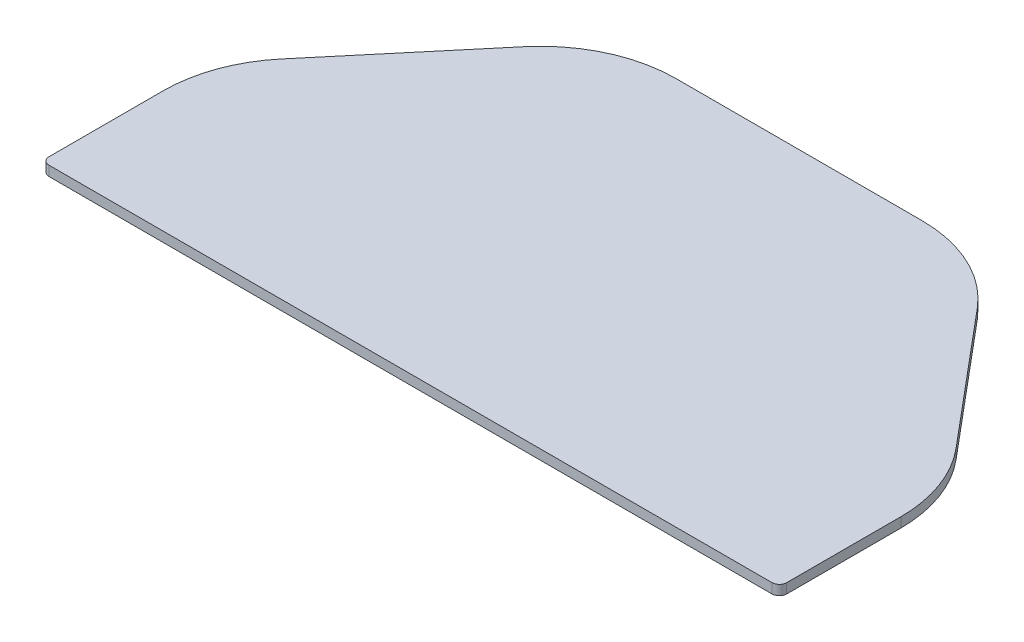
ISO-10303-21;
HEADER;
FILE_DESCRIPTION(('STEP AP214'),'2;1');
FILE_NAME('part.step','',(''),(''),'','','');
FILE_SCHEMA(('AUTOMOTIVE_DESIGN { 1 0 10303 214 1 1 1 1 }'));
ENDSEC;
DATA;
#1=APPLICATION_CONTEXT('core data for automotive mechanical design processes');
#2=APPLICATION_PROTOCOL_DEFINITION('international standard','automotive_design',2000,#1);
#3=PRODUCT_CONTEXT('',#1,'mechanical');
#4=PRODUCT('Part','Part','',(#3));
#5=PRODUCT_RELATED_PRODUCT_CATEGORY('part','',(#4));
#6=PRODUCT_DEFINITION_FORMATION('','',#4);
#7=PRODUCT_DEFINITION_CONTEXT('part definition',#1,'design');
#8=PRODUCT_DEFINITION('design','',#6,#7);
#9=PRODUCT_DEFINITION_SHAPE('','',#8);
#10=(LENGTH_UNIT() NAMED_UNIT(*) SI_UNIT(.MILLI.,.METRE.));
#11=(NAMED_UNIT(*) PLANE_ANGLE_UNIT() SI_UNIT($,.RADIAN.));
#12=(NAMED_UNIT(*) SI_UNIT($,.STERADIAN.) SOLID_ANGLE_UNIT());
#13=UNCERTAINTY_MEASURE_WITH_UNIT(LENGTH_MEASURE(1.E-05),#10,'distance_accuracy_value','');
#14=(GEOMETRIC_REPRESENTATION_CONTEXT(3) GLOBAL_UNCERTAINTY_ASSIGNED_CONTEXT((#13)) GLOBAL_UNIT_ASSIGNED_CONTEXT((#10,
#11,#12)) REPRESENTATION_CONTEXT('',''));
#15=CARTESIAN_POINT('',(0.,0.,0.));
#16=DIRECTION('',(0.,0.,1.));
#17=DIRECTION('',(1.,0.,0.));
#18=AXIS2_PLACEMENT_3D('',#15,#16,#17);
#19=CARTESIAN_POINT('',(0.,-784.,566.));
#20=DIRECTION('',(0.,1.,0.));
#21=DIRECTION('',(-1.,0.,0.));
#22=AXIS2_PLACEMENT_3D('',#19,#20,#21);
#23=PLANE('',#22);
#24=CARTESIAN_POINT('',(-147.,-784.,642.));
#25=DIRECTION('',(0.,1.,0.));
#26=DIRECTION('',(-1.,0.,0.));
#27=AXIS2_PLACEMENT_3D('',#24,#25,#26);
#28=CIRCLE('',#27,3.);
#29=CARTESIAN_POINT('',(-150.,-784.,642.));
#30=VERTEX_POINT('',#29);
#31=CARTESIAN_POINT('',(-147.,-784.,645.));
#32=VERTEX_POINT('',#31);
#33=EDGE_CURVE('E117',#30,#32,#28,.T.);
#34=ORIENTED_EDGE('',*,*,#33,.F.);
#35=DIRECTION('',(0.,0.,1.));
#36=VECTOR('',#35,1.);
#37=CARTESIAN_POINT('',(-150.,-784.,595.62891166674));
#38=LINE('',#37,#36);
#39=CARTESIAN_POINT('',(-150.,-784.,595.62891166674));
#40=VERTEX_POINT('',#39);
#41=EDGE_CURVE('E36',#40,#30,#38,.T.);
#42=ORIENTED_EDGE('',*,*,#41,.F.);
#43=CARTESIAN_POINT('',(-95.,-784.,595.62891166674));
#44=DIRECTION('',(0.,1.,0.));
#45=DIRECTION('',(-0.766044443119006,0.,-0.642787609686505));
#46=AXIS2_PLACEMENT_3D('',#43,#44,#45);
#47=CIRCLE('',#46,55.);
#48=CARTESIAN_POINT('',(-137.1324443715,-784.,560.27559313398));
#49=VERTEX_POINT('',#48);
#50=EDGE_CURVE('E158',#49,#40,#47,.T.);
#51=ORIENTED_EDGE('',*,*,#50,.F.);
#52=DIRECTION('',(-0.642787609686506,0.,0.766044443119007));
#53=VECTOR('',#52,1.);
#54=CARTESIAN_POINT('',(-92.13244437154,-784.,506.64668146724));
#55=LINE('',#54,#53);
#56=CARTESIAN_POINT('',(-92.13244437154,-784.,506.64668146724));
#57=VERTEX_POINT('',#56);
#58=EDGE_CURVE('E144',#57,#49,#55,.T.);
#59=ORIENTED_EDGE('',*,*,#58,.F.);
#60=CARTESIAN_POINT('',(-50.,-784.,542.));
#61=DIRECTION('',(0.,1.,0.));
#62=DIRECTION('',(0.,0.,-1.));
#63=AXIS2_PLACEMENT_3D('',#60,#61,#62);
#64=CIRCLE('',#63,55.);
#65=CARTESIAN_POINT('',(-50.,-784.,487.));
#66=VERTEX_POINT('',#65);
#67=EDGE_CURVE('E145',#66,#57,#64,.T.);
#68=ORIENTED_EDGE('',*,*,#67,.F.);
#69=DIRECTION('',(-1.,0.,0.));
#70=VECTOR('',#69,1.);
#71=CARTESIAN_POINT('',(50.,-784.,487.));
#72=LINE('',#71,#70);
#73=CARTESIAN_POINT('',(50.,-784.,487.));
#74=VERTEX_POINT('',#73);
#75=EDGE_CURVE('E165',#74,#66,#72,.T.);
#76=ORIENTED_EDGE('',*,*,#75,.F.);
#77=CARTESIAN_POINT('',(50.,-784.,542.));
#78=DIRECTION('',(0.,1.,0.));
#79=DIRECTION('',(0.766044443119006,0.,-0.642787609686505));
#80=AXIS2_PLACEMENT_3D('',#77,#78,#79);
#81=CIRCLE('',#80,55.);
#82=CARTESIAN_POINT('',(92.13244437154,-784.,506.64668146724));
#83=VERTEX_POINT('',#82);
#84=EDGE_CURVE('E127',#83,#74,#81,.T.);
#85=ORIENTED_EDGE('',*,*,#84,.F.);
#86=DIRECTION('',(-0.642787609686506,0.,-0.766044443119007));
#87=VECTOR('',#86,1.);
#88=CARTESIAN_POINT('',(137.1324443715,-784.,560.27559313398));
#89=LINE('',#88,#87);
#90=CARTESIAN_POINT('',(137.1324443715,-784.,560.27559313398));
#91=VERTEX_POINT('',#90);
#92=EDGE_CURVE('E134',#91,#83,#89,.T.);
#93=ORIENTED_EDGE('',*,*,#92,.F.);
#94=CARTESIAN_POINT('',(95.,-784.,595.62891166674));
#95=DIRECTION('',(0.,1.,0.));
#96=DIRECTION('',(1.,0.,0.));
#97=AXIS2_PLACEMENT_3D('',#94,#95,#96);
#98=CIRCLE('',#97,55.);
#99=CARTESIAN_POINT('',(150.,-784.,595.62891166674));
#100=VERTEX_POINT('',#99);
#101=EDGE_CURVE('E135',#100,#91,#98,.T.);
#102=ORIENTED_EDGE('',*,*,#101,.F.);
#103=DIRECTION('',(0.,0.,-1.));
#104=VECTOR('',#103,1.);
#105=CARTESIAN_POINT('',(150.,-784.,642.));
#106=LINE('',#105,#104);
#107=CARTESIAN_POINT('',(150.,-784.,642.));
#108=VERTEX_POINT('',#107);
#109=EDGE_CURVE('E174',#108,#100,#106,.T.);
#110=ORIENTED_EDGE('',*,*,#109,.F.);
#111=CARTESIAN_POINT('',(147.,-784.,642.));
#112=DIRECTION('',(0.,1.,0.));
#113=DIRECTION('',(0.,0.,1.));
#114=AXIS2_PLACEMENT_3D('',#111,#112,#113);
#115=CIRCLE('',#114,3.);
#116=CARTESIAN_POINT('',(147.,-784.,645.));
#117=VERTEX_POINT('',#116);
#118=EDGE_CURVE('E153',#117,#108,#115,.T.);
#119=ORIENTED_EDGE('',*,*,#118,.F.);
#120=DIRECTION('',(1.,0.,0.));
#121=VECTOR('',#120,1.);
#122=CARTESIAN_POINT('',(-147.,-784.,645.));
#123=LINE('',#122,#121);
#124=EDGE_CURVE('E27',#32,#117,#123,.T.);
#125=ORIENTED_EDGE('',*,*,#124,.F.);
#126=EDGE_LOOP('',(#34,#42,#51,#59,#68,#76,#85,#93,#102,#110,#119,#125));
#127=FACE_BOUND('',#126,.T.);
#128=ADVANCED_FACE('F17',(#127),#23,.F.);
#129=CARTESIAN_POINT('',(-147.,-784.,645.));
#130=DIRECTION('',(0.,0.,1.));
#131=DIRECTION('',(-1.,0.,0.));
#132=AXIS2_PLACEMENT_3D('',#129,#130,#131);
#133=PLANE('',#132);
#134=DIRECTION('',(0.,1.,0.));
#135=VECTOR('',#134,1.);
#136=CARTESIAN_POINT('',(147.,-784.,645.));
#137=LINE('',#136,#135);
#138=CARTESIAN_POINT('',(147.,-780.,645.));
#139=VERTEX_POINT('',#138);
#140=EDGE_CURVE('E11',#117,#139,#137,.T.);
#141=ORIENTED_EDGE('',*,*,#140,.T.);
#142=DIRECTION('',(1.,0.,0.));
#143=VECTOR('',#142,1.);
#144=CARTESIAN_POINT('',(-147.,-780.,645.));
#145=LINE('',#144,#143);
#146=CARTESIAN_POINT('',(-147.,-780.,645.));
#147=VERTEX_POINT('',#146);
#148=EDGE_CURVE('E102',#147,#139,#145,.T.);
#149=ORIENTED_EDGE('',*,*,#148,.F.);
#150=DIRECTION('',(0.,1.,0.));
#151=VECTOR('',#150,1.);
#152=CARTESIAN_POINT('',(-147.,-784.,645.));
#153=LINE('',#152,#151);
#154=EDGE_CURVE('E106',#32,#147,#153,.T.);
#155=ORIENTED_EDGE('',*,*,#154,.F.);
#156=ORIENTED_EDGE('',*,*,#124,.T.);
#157=EDGE_LOOP('',(#141,#149,#155,#156));
#158=FACE_BOUND('',#157,.T.);
#159=ADVANCED_FACE('F104',(#158),#133,.T.);
#160=CARTESIAN_POINT('',(-147.,-784.,642.));
#161=DIRECTION('',(0.,1.,0.));
#162=DIRECTION('',(-1.,0.,0.));
#163=AXIS2_PLACEMENT_3D('',#160,#161,#162);
#164=CYLINDRICAL_SURFACE('',#163,3.);
#165=ORIENTED_EDGE('',*,*,#154,.T.);
#166=CARTESIAN_POINT('',(-147.,-780.,642.));
#167=DIRECTION('',(0.,1.,0.));
#168=DIRECTION('',(-1.,0.,0.));
#169=AXIS2_PLACEMENT_3D('',#166,#167,#168);
#170=CIRCLE('',#169,3.);
#171=CARTESIAN_POINT('',(-150.,-780.,642.));
#172=VERTEX_POINT('',#171);
#173=EDGE_CURVE('E112',#172,#147,#170,.T.);
#174=ORIENTED_EDGE('',*,*,#173,.F.);
#175=DIRECTION('',(0.,1.,0.));
#176=VECTOR('',#175,1.);
#177=CARTESIAN_POINT('',(-150.,-784.,642.));
#178=LINE('',#177,#176);
#179=EDGE_CURVE('E162',#30,#172,#178,.T.);
#180=ORIENTED_EDGE('',*,*,#179,.F.);
#181=ORIENTED_EDGE('',*,*,#33,.T.);
#182=EDGE_LOOP('',(#165,#174,#180,#181));
#183=FACE_BOUND('',#182,.T.);
#184=ADVANCED_FACE('F115',(#183),#164,.T.);
#185=CARTESIAN_POINT('',(-150.,-784.,595.62891166674));
#186=DIRECTION('',(-1.,0.,0.));
#187=DIRECTION('',(0.,0.,1.));
#188=AXIS2_PLACEMENT_3D('',#185,#186,#187);
#189=PLANE('',#188);
#190=ORIENTED_EDGE('',*,*,#179,.T.);
#191=DIRECTION('',(0.,0.,1.));
#192=VECTOR('',#191,1.);
#193=CARTESIAN_POINT('',(-150.,-780.,595.62891166674));
#194=LINE('',#193,#192);
#195=CARTESIAN_POINT('',(-150.,-780.,595.62891166674));
#196=VERTEX_POINT('',#195);
#197=EDGE_CURVE('E123',#196,#172,#194,.T.);
#198=ORIENTED_EDGE('',*,*,#197,.F.);
#199=DIRECTION('',(0.,1.,0.));
#200=VECTOR('',#199,1.);
#201=CARTESIAN_POINT('',(-150.,-784.,595.62891166674));
#202=LINE('',#201,#200);
#203=EDGE_CURVE('E155',#40,#196,#202,.T.);
#204=ORIENTED_EDGE('',*,*,#203,.F.);
#205=ORIENTED_EDGE('',*,*,#41,.T.);
#206=EDGE_LOOP('',(#190,#198,#204,#205));
#207=FACE_BOUND('',#206,.T.);
#208=ADVANCED_FACE('F261',(#207),#189,.T.);
#209=CARTESIAN_POINT('',(-95.,-784.,595.62891166674));
#210=DIRECTION('',(0.,1.,0.));
#211=DIRECTION('',(-1.,0.,0.));
#212=AXIS2_PLACEMENT_3D('',#209,#210,#211);
#213=CYLINDRICAL_SURFACE('',#212,55.);
#214=ORIENTED_EDGE('',*,*,#203,.T.);
#215=CARTESIAN_POINT('',(-95.,-780.,595.62891166674));
#216=DIRECTION('',(0.,1.,0.));
#217=DIRECTION('',(-0.766044443119006,0.,-0.642787609686505));
#218=AXIS2_PLACEMENT_3D('',#215,#216,#217);
#219=CIRCLE('',#218,55.);
#220=CARTESIAN_POINT('',(-137.1324443715,-780.,560.27559313398));
#221=VERTEX_POINT('',#220);
#222=EDGE_CURVE('E124',#221,#196,#219,.T.);
#223=ORIENTED_EDGE('',*,*,#222,.F.);
#224=DIRECTION('',(0.,1.,0.));
#225=VECTOR('',#224,1.);
#226=CARTESIAN_POINT('',(-137.1324443715,-784.,560.27559313398));
#227=LINE('',#226,#225);
#228=EDGE_CURVE('E160',#49,#221,#227,.T.);
#229=ORIENTED_EDGE('',*,*,#228,.F.);
#230=ORIENTED_EDGE('',*,*,#50,.T.);
#231=EDGE_LOOP('',(#214,#223,#229,#230));
#232=FACE_BOUND('',#231,.T.);
#233=ADVANCED_FACE('F259',(#232),#213,.T.);
#234=CARTESIAN_POINT('',(-92.13244437154,-784.,506.64668146724));
#235=DIRECTION('',(-0.766044443119007,0.,-0.642787609686505));
#236=DIRECTION('',(0.,-1.,0.));
#237=AXIS2_PLACEMENT_3D('',#234,#235,#236);
#238=PLANE('',#237);
#239=ORIENTED_EDGE('',*,*,#228,.T.);
#240=DIRECTION('',(-0.642787609686506,0.,0.766044443119007));
#241=VECTOR('',#240,1.);
#242=CARTESIAN_POINT('',(-92.13244437154,-780.,506.64668146724));
#243=LINE('',#242,#241);
#244=CARTESIAN_POINT('',(-92.13244437154,-780.,506.64668146724));
#245=VERTEX_POINT('',#244);
#246=EDGE_CURVE('E150',#245,#221,#243,.T.);
#247=ORIENTED_EDGE('',*,*,#246,.F.);
#248=DIRECTION('',(0.,1.,0.));
#249=VECTOR('',#248,1.);
#250=CARTESIAN_POINT('',(-92.13244437154,-784.,506.64668146724));
#251=LINE('',#250,#249);
#252=EDGE_CURVE('E141',#57,#245,#251,.T.);
#253=ORIENTED_EDGE('',*,*,#252,.F.);
#254=ORIENTED_EDGE('',*,*,#58,.T.);
#255=EDGE_LOOP('',(#239,#247,#253,#254));
#256=FACE_BOUND('',#255,.T.);
#257=ADVANCED_FACE('F253',(#256),#238,.T.);
#258=CARTESIAN_POINT('',(-50.,-784.,542.));
#259=DIRECTION('',(0.,1.,0.));
#260=DIRECTION('',(-1.,0.,0.));
#261=AXIS2_PLACEMENT_3D('',#258,#259,#260);
#262=CYLINDRICAL_SURFACE('',#261,55.);
#263=ORIENTED_EDGE('',*,*,#252,.T.);
#264=CARTESIAN_POINT('',(-50.,-780.,542.));
#265=DIRECTION('',(0.,1.,0.));
#266=DIRECTION('',(0.,0.,-1.));
#267=AXIS2_PLACEMENT_3D('',#264,#265,#266);
#268=CIRCLE('',#267,55.);
#269=CARTESIAN_POINT('',(-50.,-780.,487.));
#270=VERTEX_POINT('',#269);
#271=EDGE_CURVE('E146',#270,#245,#268,.T.);
#272=ORIENTED_EDGE('',*,*,#271,.F.);
#273=DIRECTION('',(0.,1.,0.));
#274=VECTOR('',#273,1.);
#275=CARTESIAN_POINT('',(-50.,-784.,487.));
#276=LINE('',#275,#274);
#277=EDGE_CURVE('E166',#66,#270,#276,.T.);
#278=ORIENTED_EDGE('',*,*,#277,.F.);
#279=ORIENTED_EDGE('',*,*,#67,.T.);
#280=EDGE_LOOP('',(#263,#272,#278,#279));
#281=FACE_BOUND('',#280,.T.);
#282=ADVANCED_FACE('F247',(#281),#262,.T.);
#283=CARTESIAN_POINT('',(50.,-784.,487.));
#284=DIRECTION('',(0.,0.,-1.));
#285=DIRECTION('',(0.,-1.,0.));
#286=AXIS2_PLACEMENT_3D('',#283,#284,#285);
#287=PLANE('',#286);
#288=ORIENTED_EDGE('',*,*,#277,.T.);
#289=DIRECTION('',(-1.,0.,0.));
#290=VECTOR('',#289,1.);
#291=CARTESIAN_POINT('',(50.,-780.,487.));
#292=LINE('',#291,#290);
#293=CARTESIAN_POINT('',(50.,-780.,487.));
#294=VERTEX_POINT('',#293);
#295=EDGE_CURVE('E149',#294,#270,#292,.T.);
#296=ORIENTED_EDGE('',*,*,#295,.F.);
#297=DIRECTION('',(0.,1.,0.));
#298=VECTOR('',#297,1.);
#299=CARTESIAN_POINT('',(50.,-784.,487.));
#300=LINE('',#299,#298);
#301=EDGE_CURVE('E129',#74,#294,#300,.T.);
#302=ORIENTED_EDGE('',*,*,#301,.F.);
#303=ORIENTED_EDGE('',*,*,#75,.T.);
#304=EDGE_LOOP('',(#288,#296,#302,#303));
#305=FACE_BOUND('',#304,.T.);
#306=ADVANCED_FACE('F243',(#305),#287,.T.);
#307=CARTESIAN_POINT('',(50.,-784.,542.));
#308=DIRECTION('',(0.,1.,0.));
#309=DIRECTION('',(-1.,0.,0.));
#310=AXIS2_PLACEMENT_3D('',#307,#308,#309);
#311=CYLINDRICAL_SURFACE('',#310,55.);
#312=ORIENTED_EDGE('',*,*,#301,.T.);
#313=CARTESIAN_POINT('',(50.,-780.,542.));
#314=DIRECTION('',(0.,1.,0.));
#315=DIRECTION('',(0.766044443119006,0.,-0.642787609686505));
#316=AXIS2_PLACEMENT_3D('',#313,#314,#315);
#317=CIRCLE('',#316,55.);
#318=CARTESIAN_POINT('',(92.13244437154,-780.,506.64668146724));
#319=VERTEX_POINT('',#318);
#320=EDGE_CURVE('E140',#319,#294,#317,.T.);
#321=ORIENTED_EDGE('',*,*,#320,.F.);
#322=DIRECTION('',(0.,1.,0.));
#323=VECTOR('',#322,1.);
#324=CARTESIAN_POINT('',(92.13244437154,-784.,506.64668146724));
#325=LINE('',#324,#323);
#326=EDGE_CURVE('E130',#83,#319,#325,.T.);
#327=ORIENTED_EDGE('',*,*,#326,.F.);
#328=ORIENTED_EDGE('',*,*,#84,.T.);
#329=EDGE_LOOP('',(#312,#321,#327,#328));
#330=FACE_BOUND('',#329,.T.);
#331=ADVANCED_FACE('F19',(#330),#311,.T.);
#332=CARTESIAN_POINT('',(137.1324443715,-784.,560.27559313398));
#333=DIRECTION('',(0.766044443119007,0.,-0.642787609686505));
#334=DIRECTION('',(0.642787609686505,0.,0.766044443119007));
#335=AXIS2_PLACEMENT_3D('',#332,#333,#334);
#336=PLANE('',#335);
#337=ORIENTED_EDGE('',*,*,#326,.T.);
#338=DIRECTION('',(-0.642787609686506,0.,-0.766044443119007));
#339=VECTOR('',#338,1.);
#340=CARTESIAN_POINT('',(137.1324443715,-780.,560.27559313398));
#341=LINE('',#340,#339);
#342=CARTESIAN_POINT('',(137.1324443715,-780.,560.27559313398));
#343=VERTEX_POINT('',#342);
#344=EDGE_CURVE('E136',#343,#319,#341,.T.);
#345=ORIENTED_EDGE('',*,*,#344,.F.);
#346=DIRECTION('',(0.,1.,0.));
#347=VECTOR('',#346,1.);
#348=CARTESIAN_POINT('',(137.1324443715,-784.,560.27559313398));
#349=LINE('',#348,#347);
#350=EDGE_CURVE('E131',#91,#343,#349,.T.);
#351=ORIENTED_EDGE('',*,*,#350,.F.);
#352=ORIENTED_EDGE('',*,*,#92,.T.);
#353=EDGE_LOOP('',(#337,#345,#351,#352));
#354=FACE_BOUND('',#353,.T.);
#355=ADVANCED_FACE('F203',(#354),#336,.T.);
#356=CARTESIAN_POINT('',(95.,-784.,595.62891166674));
#357=DIRECTION('',(0.,1.,0.));
#358=DIRECTION('',(-1.,0.,0.));
#359=AXIS2_PLACEMENT_3D('',#356,#357,#358);
#360=CYLINDRICAL_SURFACE('',#359,55.);
#361=ORIENTED_EDGE('',*,*,#350,.T.);
#362=CARTESIAN_POINT('',(95.,-780.,595.62891166674));
#363=DIRECTION('',(0.,1.,0.));
#364=DIRECTION('',(1.,0.,0.));
#365=AXIS2_PLACEMENT_3D('',#362,#363,#364);
#366=CIRCLE('',#365,55.);
#367=CARTESIAN_POINT('',(150.,-780.,595.62891166674));
#368=VERTEX_POINT('',#367);
#369=EDGE_CURVE('E139',#368,#343,#366,.T.);
#370=ORIENTED_EDGE('',*,*,#369,.F.);
#371=DIRECTION('',(0.,1.,0.));
#372=VECTOR('',#371,1.);
#373=CARTESIAN_POINT('',(150.,-784.,595.62891166674));
#374=LINE('',#373,#372);
#375=EDGE_CURVE('E21',#100,#368,#374,.T.);
#376=ORIENTED_EDGE('',*,*,#375,.F.);
#377=ORIENTED_EDGE('',*,*,#101,.T.);
#378=EDGE_LOOP('',(#361,#370,#376,#377));
#379=FACE_BOUND('',#378,.T.);
#380=ADVANCED_FACE('F212',(#379),#360,.T.);
#381=CARTESIAN_POINT('',(150.,-784.,642.));
#382=DIRECTION('',(1.,0.,0.));
#383=DIRECTION('',(0.,1.,0.));
#384=AXIS2_PLACEMENT_3D('',#381,#382,#383);
#385=PLANE('',#384);
#386=ORIENTED_EDGE('',*,*,#375,.T.);
#387=DIRECTION('',(0.,0.,-1.));
#388=VECTOR('',#387,1.);
#389=CARTESIAN_POINT('',(150.,-780.,642.));
#390=LINE('',#389,#388);
#391=CARTESIAN_POINT('',(150.,-780.,642.));
#392=VERTEX_POINT('',#391);
#393=EDGE_CURVE('E154',#392,#368,#390,.T.);
#394=ORIENTED_EDGE('',*,*,#393,.F.);
#395=DIRECTION('',(0.,1.,0.));
#396=VECTOR('',#395,1.);
#397=CARTESIAN_POINT('',(150.,-784.,642.));
#398=LINE('',#397,#396);
#399=EDGE_CURVE('E170',#108,#392,#398,.T.);
#400=ORIENTED_EDGE('',*,*,#399,.F.);
#401=ORIENTED_EDGE('',*,*,#109,.T.);
#402=EDGE_LOOP('',(#386,#394,#400,#401));
#403=FACE_BOUND('',#402,.T.);
#404=ADVANCED_FACE('F218',(#403),#385,.T.);
#405=CARTESIAN_POINT('',(147.,-784.,642.));
#406=DIRECTION('',(0.,1.,0.));
#407=DIRECTION('',(-1.,0.,0.));
#408=AXIS2_PLACEMENT_3D('',#405,#406,#407);
#409=CYLINDRICAL_SURFACE('',#408,3.);
#410=ORIENTED_EDGE('',*,*,#399,.T.);
#411=CARTESIAN_POINT('',(147.,-780.,642.));
#412=DIRECTION('',(0.,1.,0.));
#413=DIRECTION('',(0.,0.,1.));
#414=AXIS2_PLACEMENT_3D('',#411,#412,#413);
#415=CIRCLE('',#414,3.);
#416=EDGE_CURVE('E151',#139,#392,#415,.T.);
#417=ORIENTED_EDGE('',*,*,#416,.F.);
#418=ORIENTED_EDGE('',*,*,#140,.F.);
#419=ORIENTED_EDGE('',*,*,#118,.T.);
#420=EDGE_LOOP('',(#410,#417,#418,#419));
#421=FACE_BOUND('',#420,.T.);
#422=ADVANCED_FACE('F220',(#421),#409,.T.);
#423=CARTESIAN_POINT('',(0.,-780.,566.));
#424=DIRECTION('',(0.,1.,0.));
#425=DIRECTION('',(-1.,0.,0.));
#426=AXIS2_PLACEMENT_3D('',#423,#424,#425);
#427=PLANE('',#426);
#428=ORIENTED_EDGE('',*,*,#416,.T.);
#429=ORIENTED_EDGE('',*,*,#393,.T.);
#430=ORIENTED_EDGE('',*,*,#369,.T.);
#431=ORIENTED_EDGE('',*,*,#344,.T.);
#432=ORIENTED_EDGE('',*,*,#320,.T.);
#433=ORIENTED_EDGE('',*,*,#295,.T.);
#434=ORIENTED_EDGE('',*,*,#271,.T.);
#435=ORIENTED_EDGE('',*,*,#246,.T.);
#436=ORIENTED_EDGE('',*,*,#222,.T.);
#437=ORIENTED_EDGE('',*,*,#197,.T.);
#438=ORIENTED_EDGE('',*,*,#173,.T.);
#439=ORIENTED_EDGE('',*,*,#148,.T.);
#440=EDGE_LOOP('',(#428,#429,#430,#431,#432,#433,#434,#435,#436,#437,#438,#439));
#441=FACE_BOUND('',#440,.T.);
#442=ADVANCED_FACE('F121',(#441),#427,.T.);
#443=CLOSED_SHELL('',(#128,#159,#184,#208,#233,#257,#282,#306,#331,#355,#380,#404,#422,#442));
#444=MANIFOLD_SOLID_BREP('B1',#443);
#445=ADVANCED_BREP_SHAPE_REPRESENTATION('',(#18,#444),#14);
#446=SHAPE_DEFINITION_REPRESENTATION(#9,#445);
ENDSEC;
END-ISO-10303-21;
